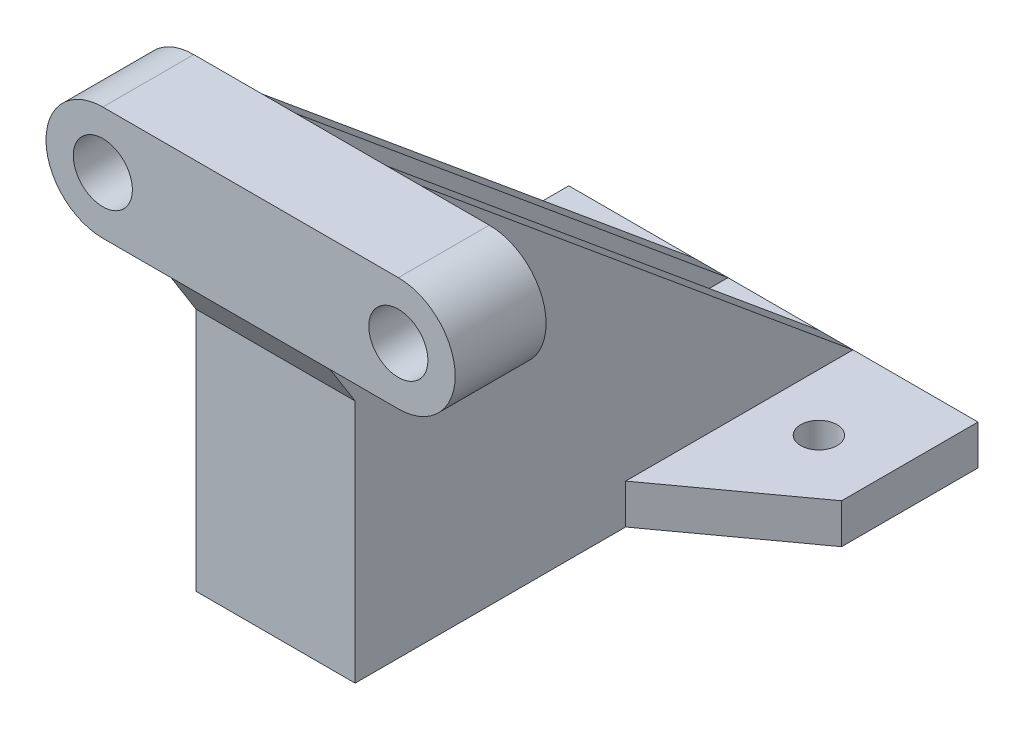
ISO-10303-21;
HEADER;
FILE_DESCRIPTION(('STEP AP214'),'2;1');
FILE_NAME('part.step','',(''),(''),'','','');
FILE_SCHEMA(('AUTOMOTIVE_DESIGN { 1 0 10303 214 1 1 1 1 }'));
ENDSEC;
DATA;
#1=APPLICATION_CONTEXT('core data for automotive mechanical design processes');
#2=APPLICATION_PROTOCOL_DEFINITION('international standard','automotive_design',2000,#1);
#3=PRODUCT_CONTEXT('',#1,'mechanical');
#4=PRODUCT('Part','Part','',(#3));
#5=PRODUCT_RELATED_PRODUCT_CATEGORY('part','',(#4));
#6=PRODUCT_DEFINITION_FORMATION('','',#4);
#7=PRODUCT_DEFINITION_CONTEXT('part definition',#1,'design');
#8=PRODUCT_DEFINITION('design','',#6,#7);
#9=PRODUCT_DEFINITION_SHAPE('','',#8);
#10=(LENGTH_UNIT() NAMED_UNIT(*) SI_UNIT(.MILLI.,.METRE.));
#11=(NAMED_UNIT(*) PLANE_ANGLE_UNIT() SI_UNIT($,.RADIAN.));
#12=(NAMED_UNIT(*) SI_UNIT($,.STERADIAN.) SOLID_ANGLE_UNIT());
#13=UNCERTAINTY_MEASURE_WITH_UNIT(LENGTH_MEASURE(1.E-05),#10,'distance_accuracy_value','');
#14=(GEOMETRIC_REPRESENTATION_CONTEXT(3) GLOBAL_UNCERTAINTY_ASSIGNED_CONTEXT((#13)) GLOBAL_UNIT_ASSIGNED_CONTEXT((#10,
#11,#12)) REPRESENTATION_CONTEXT('',''));
#15=CARTESIAN_POINT('',(0.,0.,0.));
#16=DIRECTION('',(0.,0.,1.));
#17=DIRECTION('',(1.,0.,0.));
#18=AXIS2_PLACEMENT_3D('',#15,#16,#17);
#19=CARTESIAN_POINT('',(-13.,30.,0.));
#20=DIRECTION('',(0.,0.,1.));
#21=DIRECTION('',(1.,0.,0.));
#22=AXIS2_PLACEMENT_3D('',#19,#20,#21);
#23=PLANE('',#22);
#24=DIRECTION('',(0.,-1.,0.));
#25=VECTOR('',#24,1.);
#26=CARTESIAN_POINT('',(4.,3.5,0.));
#27=LINE('',#26,#25);
#28=CARTESIAN_POINT('',(4.,35.,0.));
#29=VERTEX_POINT('',#28);
#30=CARTESIAN_POINT('',(4.,5.5,0.));
#31=VERTEX_POINT('',#30);
#32=EDGE_CURVE('E254',#29,#31,#27,.T.);
#33=ORIENTED_EDGE('',*,*,#32,.T.);
#34=DIRECTION('',(-1.,0.,0.));
#35=VECTOR('',#34,1.);
#36=CARTESIAN_POINT('',(-13.,5.5,0.));
#37=LINE('',#36,#35);
#38=CARTESIAN_POINT('',(-4.,5.5,0.));
#39=VERTEX_POINT('',#38);
#40=EDGE_CURVE('E26',#31,#39,#37,.T.);
#41=ORIENTED_EDGE('',*,*,#40,.T.);
#42=DIRECTION('',(0.,-1.,0.));
#43=VECTOR('',#42,1.);
#44=CARTESIAN_POINT('',(-4.,3.5,0.));
#45=LINE('',#44,#43);
#46=CARTESIAN_POINT('',(-4.,35.,0.));
#47=VERTEX_POINT('',#46);
#48=EDGE_CURVE('E225',#47,#39,#45,.T.);
#49=ORIENTED_EDGE('',*,*,#48,.F.);
#50=DIRECTION('',(-1.,0.,0.));
#51=VECTOR('',#50,1.);
#52=CARTESIAN_POINT('',(-13.,35.,0.));
#53=LINE('',#52,#51);
#54=EDGE_CURVE('E447',#29,#47,#53,.T.);
#55=ORIENTED_EDGE('',*,*,#54,.F.);
#56=EDGE_LOOP('',(#33,#41,#49,#55));
#57=FACE_BOUND('',#56,.T.);
#58=ADVANCED_FACE('F17',(#57),#23,.F.);
#59=CARTESIAN_POINT('',(-7.,3.5,0.));
#60=DIRECTION('',(0.,1.,0.));
#61=DIRECTION('',(0.,0.,1.));
#62=AXIS2_PLACEMENT_3D('',#59,#60,#61);
#63=PLANE('',#62);
#64=CARTESIAN_POINT('',(0.,3.5,-30.));
#65=DIRECTION('',(0.,1.,0.));
#66=DIRECTION('',(0.,0.,1.));
#67=AXIS2_PLACEMENT_3D('',#64,#65,#66);
#68=CIRCLE('',#67,1.6);
#69=CARTESIAN_POINT('',(0.,3.5,-28.4));
#70=VERTEX_POINT('',#69);
#71=EDGE_CURVE('E291',#70,#70,#68,.T.);
#72=ORIENTED_EDGE('',*,*,#71,.F.);
#73=EDGE_LOOP('',(#72));
#74=FACE_BOUND('',#73,.T.);
#75=CARTESIAN_POINT('',(0.,3.5,-18.));
#76=DIRECTION('',(0.,1.,0.));
#77=DIRECTION('',(0.,0.,1.));
#78=AXIS2_PLACEMENT_3D('',#75,#76,#77);
#79=CIRCLE('',#78,1.6);
#80=CARTESIAN_POINT('',(0.,3.5,-16.4));
#81=VERTEX_POINT('',#80);
#82=EDGE_CURVE('E307',#81,#81,#79,.T.);
#83=ORIENTED_EDGE('',*,*,#82,.F.);
#84=EDGE_LOOP('',(#83));
#85=FACE_BOUND('',#84,.T.);
#86=CARTESIAN_POINT('',(0.,3.5,-6.));
#87=DIRECTION('',(0.,1.,0.));
#88=DIRECTION('',(0.,0.,1.));
#89=AXIS2_PLACEMENT_3D('',#86,#87,#88);
#90=CIRCLE('',#89,1.6);
#91=CARTESIAN_POINT('',(0.,3.5,-4.4));
#92=VERTEX_POINT('',#91);
#93=EDGE_CURVE('E315',#92,#92,#90,.T.);
#94=ORIENTED_EDGE('',*,*,#93,.F.);
#95=EDGE_LOOP('',(#94));
#96=FACE_BOUND('',#95,.T.);
#97=DIRECTION('',(0.,0.,-1.));
#98=VECTOR('',#97,1.);
#99=CARTESIAN_POINT('',(-4.,3.5,-38.));
#100=LINE('',#99,#98);
#101=CARTESIAN_POINT('',(-4.,3.5,-2.));
#102=VERTEX_POINT('',#101);
#103=CARTESIAN_POINT('',(-4.,3.5,-38.));
#104=VERTEX_POINT('',#103);
#105=EDGE_CURVE('E253',#102,#104,#100,.T.);
#106=ORIENTED_EDGE('',*,*,#105,.F.);
#107=DIRECTION('',(1.,0.,0.));
#108=VECTOR('',#107,1.);
#109=CARTESIAN_POINT('',(-7.,3.5,-2.));
#110=LINE('',#109,#108);
#111=CARTESIAN_POINT('',(4.,3.5,-2.));
#112=VERTEX_POINT('',#111);
#113=EDGE_CURVE('E474',#102,#112,#110,.T.);
#114=ORIENTED_EDGE('',*,*,#113,.T.);
#115=DIRECTION('',(0.,0.,-1.));
#116=VECTOR('',#115,1.);
#117=CARTESIAN_POINT('',(4.,3.5,-38.));
#118=LINE('',#117,#116);
#119=CARTESIAN_POINT('',(4.,3.5,-38.));
#120=VERTEX_POINT('',#119);
#121=EDGE_CURVE('E257',#112,#120,#118,.T.);
#122=ORIENTED_EDGE('',*,*,#121,.T.);
#123=DIRECTION('',(-1.,0.,0.));
#124=VECTOR('',#123,1.);
#125=CARTESIAN_POINT('',(7.,3.5,-38.));
#126=LINE('',#125,#124);
#127=EDGE_CURVE('E210',#120,#104,#126,.T.);
#128=ORIENTED_EDGE('',*,*,#127,.T.);
#129=EDGE_LOOP('',(#106,#114,#122,#128));
#130=FACE_BOUND('',#129,.T.);
#131=ADVANCED_FACE('F579',(#74,#85,#96,#130),#63,.T.);
#132=CARTESIAN_POINT('',(-13.,30.,0.));
#133=DIRECTION('',(0.,0.,1.));
#134=DIRECTION('',(1.,0.,0.));
#135=AXIS2_PLACEMENT_3D('',#132,#133,#134);
#136=CIRCLE('',#135,2.6);
#137=CARTESIAN_POINT('',(-10.4,30.,0.));
#138=VERTEX_POINT('',#137);
#139=EDGE_CURVE('E402',#138,#138,#136,.T.);
#140=ORIENTED_EDGE('',*,*,#139,.T.);
#141=EDGE_LOOP('',(#140));
#142=FACE_BOUND('',#141,.T.);
#143=CARTESIAN_POINT('',(-7.,35.,0.));
#144=VERTEX_POINT('',#143);
#145=CARTESIAN_POINT('',(-13.,35.,0.));
#146=VERTEX_POINT('',#145);
#147=EDGE_CURVE('E443',#144,#146,#53,.T.);
#148=ORIENTED_EDGE('',*,*,#147,.F.);
#149=DIRECTION('',(0.,-1.,0.));
#150=VECTOR('',#149,1.);
#151=CARTESIAN_POINT('',(-7.,3.5,0.));
#152=LINE('',#151,#150);
#153=CARTESIAN_POINT('',(-7.,25.,0.));
#154=VERTEX_POINT('',#153);
#155=EDGE_CURVE('E242',#144,#154,#152,.T.);
#156=ORIENTED_EDGE('',*,*,#155,.T.);
#157=DIRECTION('',(1.,0.,0.));
#158=VECTOR('',#157,1.);
#159=CARTESIAN_POINT('',(-13.,25.,0.));
#160=LINE('',#159,#158);
#161=CARTESIAN_POINT('',(-13.,25.,0.));
#162=VERTEX_POINT('',#161);
#163=EDGE_CURVE('E436',#162,#154,#160,.T.);
#164=ORIENTED_EDGE('',*,*,#163,.F.);
#165=CARTESIAN_POINT('',(-13.,30.,0.));
#166=DIRECTION('',(0.,0.,1.));
#167=DIRECTION('',(1.,0.,0.));
#168=AXIS2_PLACEMENT_3D('',#165,#166,#167);
#169=CIRCLE('',#168,5.);
#170=EDGE_CURVE('E410',#146,#162,#169,.T.);
#171=ORIENTED_EDGE('',*,*,#170,.F.);
#172=EDGE_LOOP('',(#148,#156,#164,#171));
#173=FACE_BOUND('',#172,.T.);
#174=ADVANCED_FACE('F634',(#142,#173),#23,.F.);
#175=DIRECTION('',(0.,0.,-1.));
#176=VECTOR('',#175,1.);
#177=CARTESIAN_POINT('',(-7.,3.5,-38.));
#178=LINE('',#177,#176);
#179=CARTESIAN_POINT('',(-7.,3.5,-18.));
#180=VERTEX_POINT('',#179);
#181=CARTESIAN_POINT('',(-7.,3.5,-38.));
#182=VERTEX_POINT('',#181);
#183=EDGE_CURVE('E215',#180,#182,#178,.T.);
#184=ORIENTED_EDGE('',*,*,#183,.T.);
#185=CARTESIAN_POINT('',(-18.,3.5,-38.));
#186=VERTEX_POINT('',#185);
#187=EDGE_CURVE('E198',#182,#186,#126,.T.);
#188=ORIENTED_EDGE('',*,*,#187,.T.);
#189=DIRECTION('',(0.,0.,1.));
#190=VECTOR('',#189,1.);
#191=CARTESIAN_POINT('',(-18.,3.5,-38.));
#192=LINE('',#191,#190);
#193=CARTESIAN_POINT('',(-18.,3.5,-26.));
#194=VERTEX_POINT('',#193);
#195=EDGE_CURVE('E331',#186,#194,#192,.T.);
#196=ORIENTED_EDGE('',*,*,#195,.T.);
#197=DIRECTION('',(0.808736084303188,0.,0.588171697675046));
#198=VECTOR('',#197,1.);
#199=CARTESIAN_POINT('',(-18.,3.5,-26.));
#200=LINE('',#199,#198);
#201=EDGE_CURVE('E219',#194,#180,#200,.T.);
#202=ORIENTED_EDGE('',*,*,#201,.T.);
#203=EDGE_LOOP('',(#184,#188,#196,#202));
#204=FACE_BOUND('',#203,.T.);
#205=CARTESIAN_POINT('',(-12.,3.5,-30.));
#206=DIRECTION('',(0.,1.,0.));
#207=DIRECTION('',(0.,0.,1.));
#208=AXIS2_PLACEMENT_3D('',#205,#206,#207);
#209=CIRCLE('',#208,1.6);
#210=CARTESIAN_POINT('',(-12.,3.5,-28.4));
#211=VERTEX_POINT('',#210);
#212=EDGE_CURVE('E299',#211,#211,#209,.T.);
#213=ORIENTED_EDGE('',*,*,#212,.F.);
#214=EDGE_LOOP('',(#213));
#215=FACE_BOUND('',#214,.T.);
#216=ADVANCED_FACE('F216',(#204,#215),#63,.T.);
#217=CARTESIAN_POINT('',(13.,30.,0.));
#218=DIRECTION('',(0.,0.,1.));
#219=DIRECTION('',(1.,0.,0.));
#220=AXIS2_PLACEMENT_3D('',#217,#218,#219);
#221=CIRCLE('',#220,2.6);
#222=CARTESIAN_POINT('',(15.6,30.,0.));
#223=VERTEX_POINT('',#222);
#224=EDGE_CURVE('E382',#223,#223,#221,.T.);
#225=ORIENTED_EDGE('',*,*,#224,.T.);
#226=EDGE_LOOP('',(#225));
#227=FACE_BOUND('',#226,.T.);
#228=CARTESIAN_POINT('',(7.,25.,0.));
#229=VERTEX_POINT('',#228);
#230=CARTESIAN_POINT('',(13.,25.,0.));
#231=VERTEX_POINT('',#230);
#232=EDGE_CURVE('E435',#229,#231,#160,.T.);
#233=ORIENTED_EDGE('',*,*,#232,.F.);
#234=DIRECTION('',(0.,-1.,0.));
#235=VECTOR('',#234,1.);
#236=CARTESIAN_POINT('',(7.,3.5,0.));
#237=LINE('',#236,#235);
#238=CARTESIAN_POINT('',(7.,35.,0.));
#239=VERTEX_POINT('',#238);
#240=EDGE_CURVE('E237',#239,#229,#237,.T.);
#241=ORIENTED_EDGE('',*,*,#240,.F.);
#242=CARTESIAN_POINT('',(13.,35.,0.));
#243=VERTEX_POINT('',#242);
#244=EDGE_CURVE('E419',#243,#239,#53,.T.);
#245=ORIENTED_EDGE('',*,*,#244,.F.);
#246=CARTESIAN_POINT('',(13.,30.,0.));
#247=DIRECTION('',(0.,0.,1.));
#248=DIRECTION('',(1.,0.,0.));
#249=AXIS2_PLACEMENT_3D('',#246,#247,#248);
#250=CIRCLE('',#249,5.);
#251=EDGE_CURVE('E440',#231,#243,#250,.T.);
#252=ORIENTED_EDGE('',*,*,#251,.F.);
#253=EDGE_LOOP('',(#233,#241,#245,#252));
#254=FACE_BOUND('',#253,.T.);
#255=ADVANCED_FACE('F640',(#227,#254),#23,.F.);
#256=CARTESIAN_POINT('',(-13.,25.,8.));
#257=DIRECTION('',(0.,1.,0.));
#258=DIRECTION('',(0.,0.,1.));
#259=AXIS2_PLACEMENT_3D('',#256,#257,#258);
#260=PLANE('',#259);
#261=DIRECTION('',(0.,0.,-1.));
#262=VECTOR('',#261,1.);
#263=CARTESIAN_POINT('',(-7.,25.,5.8));
#264=LINE('',#263,#262);
#265=CARTESIAN_POINT('',(-7.,25.,8.));
#266=VERTEX_POINT('',#265);
#267=EDGE_CURVE('E372',#266,#154,#264,.T.);
#268=ORIENTED_EDGE('',*,*,#267,.F.);
#269=DIRECTION('',(1.,0.,0.));
#270=VECTOR('',#269,1.);
#271=CARTESIAN_POINT('',(-13.,25.,8.));
#272=LINE('',#271,#270);
#273=CARTESIAN_POINT('',(-13.,25.,8.));
#274=VERTEX_POINT('',#273);
#275=EDGE_CURVE('E420',#274,#266,#272,.T.);
#276=ORIENTED_EDGE('',*,*,#275,.F.);
#277=DIRECTION('',(0.,0.,-1.));
#278=VECTOR('',#277,1.);
#279=CARTESIAN_POINT('',(-13.,25.,8.));
#280=LINE('',#279,#278);
#281=EDGE_CURVE('E459',#274,#162,#280,.T.);
#282=ORIENTED_EDGE('',*,*,#281,.T.);
#283=ORIENTED_EDGE('',*,*,#163,.T.);
#284=EDGE_LOOP('',(#268,#276,#282,#283));
#285=FACE_BOUND('',#284,.T.);
#286=ADVANCED_FACE('F631',(#285),#260,.F.);
#287=CARTESIAN_POINT('',(7.,25.,8.));
#288=VERTEX_POINT('',#287);
#289=CARTESIAN_POINT('',(13.,25.,8.));
#290=VERTEX_POINT('',#289);
#291=EDGE_CURVE('E418',#288,#290,#272,.T.);
#292=ORIENTED_EDGE('',*,*,#291,.F.);
#293=DIRECTION('',(0.,0.,1.));
#294=VECTOR('',#293,1.);
#295=CARTESIAN_POINT('',(7.,25.,0.));
#296=LINE('',#295,#294);
#297=EDGE_CURVE('E385',#229,#288,#296,.T.);
#298=ORIENTED_EDGE('',*,*,#297,.F.);
#299=ORIENTED_EDGE('',*,*,#232,.T.);
#300=DIRECTION('',(0.,0.,-1.));
#301=VECTOR('',#300,1.);
#302=CARTESIAN_POINT('',(13.,25.,8.));
#303=LINE('',#302,#301);
#304=EDGE_CURVE('E455',#290,#231,#303,.T.);
#305=ORIENTED_EDGE('',*,*,#304,.F.);
#306=EDGE_LOOP('',(#292,#298,#299,#305));
#307=FACE_BOUND('',#306,.T.);
#308=ADVANCED_FACE('F657',(#307),#260,.F.);
#309=CARTESIAN_POINT('',(-13.,30.,8.));
#310=DIRECTION('',(0.,0.,1.));
#311=DIRECTION('',(1.,0.,0.));
#312=AXIS2_PLACEMENT_3D('',#309,#310,#311);
#313=PLANE('',#312);
#314=CARTESIAN_POINT('',(-13.,30.,8.));
#315=DIRECTION('',(0.,0.,1.));
#316=DIRECTION('',(1.,0.,0.));
#317=AXIS2_PLACEMENT_3D('',#314,#315,#316);
#318=CIRCLE('',#317,2.6);
#319=CARTESIAN_POINT('',(-10.4,30.,8.));
#320=VERTEX_POINT('',#319);
#321=EDGE_CURVE('E406',#320,#320,#318,.T.);
#322=ORIENTED_EDGE('',*,*,#321,.F.);
#323=EDGE_LOOP('',(#322));
#324=FACE_BOUND('',#323,.T.);
#325=CARTESIAN_POINT('',(-13.,30.,8.));
#326=DIRECTION('',(0.,0.,1.));
#327=DIRECTION('',(1.,0.,0.));
#328=AXIS2_PLACEMENT_3D('',#325,#326,#327);
#329=CIRCLE('',#328,5.);
#330=CARTESIAN_POINT('',(-13.,35.,8.));
#331=VERTEX_POINT('',#330);
#332=EDGE_CURVE('E414',#331,#274,#329,.T.);
#333=ORIENTED_EDGE('',*,*,#332,.T.);
#334=ORIENTED_EDGE('',*,*,#275,.T.);
#335=EDGE_CURVE('E425',#266,#288,#272,.T.);
#336=ORIENTED_EDGE('',*,*,#335,.T.);
#337=ORIENTED_EDGE('',*,*,#291,.T.);
#338=CARTESIAN_POINT('',(13.,30.,8.));
#339=DIRECTION('',(0.,0.,1.));
#340=DIRECTION('',(1.,0.,0.));
#341=AXIS2_PLACEMENT_3D('',#338,#339,#340);
#342=CIRCLE('',#341,5.);
#343=CARTESIAN_POINT('',(13.,35.,8.));
#344=VERTEX_POINT('',#343);
#345=EDGE_CURVE('E424',#290,#344,#342,.T.);
#346=ORIENTED_EDGE('',*,*,#345,.T.);
#347=DIRECTION('',(-1.,0.,0.));
#348=VECTOR('',#347,1.);
#349=CARTESIAN_POINT('',(-13.,35.,8.));
#350=LINE('',#349,#348);
#351=EDGE_CURVE('E428',#344,#331,#350,.T.);
#352=ORIENTED_EDGE('',*,*,#351,.T.);
#353=EDGE_LOOP('',(#333,#334,#336,#337,#346,#352));
#354=FACE_BOUND('',#353,.T.);
#355=CARTESIAN_POINT('',(13.,30.,8.));
#356=DIRECTION('',(0.,0.,1.));
#357=DIRECTION('',(1.,0.,0.));
#358=AXIS2_PLACEMENT_3D('',#355,#356,#357);
#359=CIRCLE('',#358,2.6);
#360=CARTESIAN_POINT('',(15.6,30.,8.));
#361=VERTEX_POINT('',#360);
#362=EDGE_CURVE('E398',#361,#361,#359,.T.);
#363=ORIENTED_EDGE('',*,*,#362,.F.);
#364=EDGE_LOOP('',(#363));
#365=FACE_BOUND('',#364,.T.);
#366=ADVANCED_FACE('F624',(#324,#354,#365),#313,.T.);
#367=CARTESIAN_POINT('',(-13.,30.,8.));
#368=DIRECTION('',(0.,0.,-1.));
#369=DIRECTION('',(-1.,0.,0.));
#370=AXIS2_PLACEMENT_3D('',#367,#368,#369);
#371=CYLINDRICAL_SURFACE('',#370,5.);
#372=ORIENTED_EDGE('',*,*,#170,.T.);
#373=ORIENTED_EDGE('',*,*,#281,.F.);
#374=ORIENTED_EDGE('',*,*,#332,.F.);
#375=DIRECTION('',(0.,0.,-1.));
#376=VECTOR('',#375,1.);
#377=CARTESIAN_POINT('',(-13.,35.,8.));
#378=LINE('',#377,#376);
#379=EDGE_CURVE('E431',#331,#146,#378,.T.);
#380=ORIENTED_EDGE('',*,*,#379,.T.);
#381=EDGE_LOOP('',(#372,#373,#374,#380));
#382=FACE_BOUND('',#381,.T.);
#383=ADVANCED_FACE('F671',(#382),#371,.T.);
#384=CARTESIAN_POINT('',(13.,30.,8.));
#385=DIRECTION('',(0.,0.,-1.));
#386=DIRECTION('',(-1.,0.,0.));
#387=AXIS2_PLACEMENT_3D('',#384,#385,#386);
#388=CYLINDRICAL_SURFACE('',#387,5.);
#389=ORIENTED_EDGE('',*,*,#251,.T.);
#390=DIRECTION('',(0.,0.,-1.));
#391=VECTOR('',#390,1.);
#392=CARTESIAN_POINT('',(13.,35.,8.));
#393=LINE('',#392,#391);
#394=EDGE_CURVE('E451',#344,#243,#393,.T.);
#395=ORIENTED_EDGE('',*,*,#394,.F.);
#396=ORIENTED_EDGE('',*,*,#345,.F.);
#397=ORIENTED_EDGE('',*,*,#304,.T.);
#398=EDGE_LOOP('',(#389,#395,#396,#397));
#399=FACE_BOUND('',#398,.T.);
#400=ADVANCED_FACE('F668',(#399),#388,.T.);
#401=CARTESIAN_POINT('',(-13.,35.,8.));
#402=DIRECTION('',(0.,-1.,0.));
#403=DIRECTION('',(0.,0.,-1.));
#404=AXIS2_PLACEMENT_3D('',#401,#402,#403);
#405=PLANE('',#404);
#406=ORIENTED_EDGE('',*,*,#244,.T.);
#407=DIRECTION('',(1.,0.,0.));
#408=VECTOR('',#407,1.);
#409=CARTESIAN_POINT('',(4.,35.,0.));
#410=LINE('',#409,#408);
#411=EDGE_CURVE('E276',#29,#239,#410,.T.);
#412=ORIENTED_EDGE('',*,*,#411,.F.);
#413=ORIENTED_EDGE('',*,*,#54,.T.);
#414=DIRECTION('',(-1.,0.,0.));
#415=VECTOR('',#414,1.);
#416=CARTESIAN_POINT('',(-4.,35.,0.));
#417=LINE('',#416,#415);
#418=EDGE_CURVE('E238',#47,#144,#417,.T.);
#419=ORIENTED_EDGE('',*,*,#418,.T.);
#420=ORIENTED_EDGE('',*,*,#147,.T.);
#421=ORIENTED_EDGE('',*,*,#379,.F.);
#422=ORIENTED_EDGE('',*,*,#351,.F.);
#423=ORIENTED_EDGE('',*,*,#394,.T.);
#424=EDGE_LOOP('',(#406,#412,#413,#419,#420,#421,#422,#423));
#425=FACE_BOUND('',#424,.T.);
#426=ADVANCED_FACE('F637',(#425),#405,.F.);
#427=CARTESIAN_POINT('',(-13.,30.,8.));
#428=DIRECTION('',(0.,0.,-1.));
#429=DIRECTION('',(-1.,0.,0.));
#430=AXIS2_PLACEMENT_3D('',#427,#428,#429);
#431=CYLINDRICAL_SURFACE('',#430,2.6);
#432=ORIENTED_EDGE('',*,*,#321,.T.);
#433=EDGE_LOOP('',(#432));
#434=FACE_BOUND('',#433,.T.);
#435=ORIENTED_EDGE('',*,*,#139,.F.);
#436=EDGE_LOOP('',(#435));
#437=FACE_BOUND('',#436,.T.);
#438=ADVANCED_FACE('F700',(#434,#437),#431,.F.);
#439=CARTESIAN_POINT('',(13.,30.,8.));
#440=DIRECTION('',(0.,0.,-1.));
#441=DIRECTION('',(-1.,0.,0.));
#442=AXIS2_PLACEMENT_3D('',#439,#440,#441);
#443=CYLINDRICAL_SURFACE('',#442,2.6);
#444=ORIENTED_EDGE('',*,*,#362,.T.);
#445=EDGE_LOOP('',(#444));
#446=FACE_BOUND('',#445,.T.);
#447=ORIENTED_EDGE('',*,*,#224,.F.);
#448=EDGE_LOOP('',(#447));
#449=FACE_BOUND('',#448,.T.);
#450=ADVANCED_FACE('F695',(#446,#449),#443,.F.);
#451=CARTESIAN_POINT('',(7.,-15.1538773916117,0.));
#452=DIRECTION('',(-1.,0.,0.));
#453=DIRECTION('',(0.,0.,1.));
#454=AXIS2_PLACEMENT_3D('',#451,#452,#453);
#455=PLANE('',#454);
#456=ORIENTED_EDGE('',*,*,#240,.T.);
#457=ORIENTED_EDGE('',*,*,#297,.T.);
#458=DIRECTION('',(0.,0.846636549211004,0.532171545218347));
#459=VECTOR('',#458,1.);
#460=CARTESIAN_POINT('',(7.,-7.38648320931787,-12.3572180172856));
#461=LINE('',#460,#459);
#462=CARTESIAN_POINT('',(7.,21.5,5.8));
#463=VERTEX_POINT('',#462);
#464=EDGE_CURVE('E471',#288,#463,#461,.F.);
#465=ORIENTED_EDGE('',*,*,#464,.T.);
#466=DIRECTION('',(0.,1.,0.));
#467=VECTOR('',#466,1.);
#468=CARTESIAN_POINT('',(7.,-15.1538773916117,5.8));
#469=LINE('',#468,#467);
#470=CARTESIAN_POINT('',(7.,0.,5.8));
#471=VERTEX_POINT('',#470);
#472=EDGE_CURVE('E388',#471,#463,#469,.T.);
#473=ORIENTED_EDGE('',*,*,#472,.F.);
#474=DIRECTION('',(0.,0.,-1.));
#475=VECTOR('',#474,1.);
#476=CARTESIAN_POINT('',(7.,0.,0.));
#477=LINE('',#476,#475);
#478=CARTESIAN_POINT('',(7.,0.,-18.));
#479=VERTEX_POINT('',#478);
#480=EDGE_CURVE('E378',#471,#479,#477,.T.);
#481=ORIENTED_EDGE('',*,*,#480,.T.);
#482=DIRECTION('',(0.,-1.,0.));
#483=VECTOR('',#482,1.);
#484=CARTESIAN_POINT('',(7.,3.5,-18.));
#485=LINE('',#484,#483);
#486=CARTESIAN_POINT('',(7.,3.5,-18.));
#487=VERTEX_POINT('',#486);
#488=EDGE_CURVE('E368',#487,#479,#485,.T.);
#489=ORIENTED_EDGE('',*,*,#488,.F.);
#490=DIRECTION('',(0.,0.,-1.));
#491=VECTOR('',#490,1.);
#492=CARTESIAN_POINT('',(7.,3.5,-38.));
#493=LINE('',#492,#491);
#494=CARTESIAN_POINT('',(7.,3.5,-38.));
#495=VERTEX_POINT('',#494);
#496=EDGE_CURVE('E269',#487,#495,#493,.T.);
#497=ORIENTED_EDGE('',*,*,#496,.T.);
#498=DIRECTION('',(0.,0.638189460570586,0.769879349259755));
#499=VECTOR('',#498,1.);
#500=CARTESIAN_POINT('',(7.,35.,0.));
#501=LINE('',#500,#499);
#502=EDGE_CURVE('E258',#495,#239,#501,.T.);
#503=ORIENTED_EDGE('',*,*,#502,.T.);
#504=EDGE_LOOP('',(#456,#457,#465,#473,#481,#489,#497,#503));
#505=FACE_BOUND('',#504,.T.);
#506=ADVANCED_FACE('F595',(#505),#455,.F.);
#507=CARTESIAN_POINT('',(-7.,-15.1538773916117,5.8));
#508=DIRECTION('',(1.,0.,0.));
#509=DIRECTION('',(0.,0.,-1.));
#510=AXIS2_PLACEMENT_3D('',#507,#508,#509);
#511=PLANE('',#510);
#512=ORIENTED_EDGE('',*,*,#267,.T.);
#513=ORIENTED_EDGE('',*,*,#155,.F.);
#514=DIRECTION('',(0.,0.638189460570586,0.769879349259755));
#515=VECTOR('',#514,1.);
#516=CARTESIAN_POINT('',(-7.,35.,0.));
#517=LINE('',#516,#515);
#518=EDGE_CURVE('E226',#182,#144,#517,.T.);
#519=ORIENTED_EDGE('',*,*,#518,.F.);
#520=ORIENTED_EDGE('',*,*,#183,.F.);
#521=DIRECTION('',(0.,-1.,0.));
#522=VECTOR('',#521,1.);
#523=CARTESIAN_POINT('',(-7.,3.5,-18.));
#524=LINE('',#523,#522);
#525=CARTESIAN_POINT('',(-7.,0.,-18.));
#526=VERTEX_POINT('',#525);
#527=EDGE_CURVE('E336',#180,#526,#524,.T.);
#528=ORIENTED_EDGE('',*,*,#527,.T.);
#529=DIRECTION('',(0.,0.,1.));
#530=VECTOR('',#529,1.);
#531=CARTESIAN_POINT('',(-7.,0.,5.8));
#532=LINE('',#531,#530);
#533=CARTESIAN_POINT('',(-7.,0.,5.8));
#534=VERTEX_POINT('',#533);
#535=EDGE_CURVE('E373',#526,#534,#532,.T.);
#536=ORIENTED_EDGE('',*,*,#535,.T.);
#537=DIRECTION('',(0.,1.,0.));
#538=VECTOR('',#537,1.);
#539=CARTESIAN_POINT('',(-7.,-15.1538773916117,5.8));
#540=LINE('',#539,#538);
#541=CARTESIAN_POINT('',(-7.,21.5,5.8));
#542=VERTEX_POINT('',#541);
#543=EDGE_CURVE('E392',#534,#542,#540,.T.);
#544=ORIENTED_EDGE('',*,*,#543,.T.);
#545=DIRECTION('',(0.,-0.846636549211004,-0.532171545218347));
#546=VECTOR('',#545,1.);
#547=CARTESIAN_POINT('',(-7.,-4.77325910165256,-10.7146200067531));
#548=LINE('',#547,#546);
#549=EDGE_CURVE('E467',#542,#266,#548,.F.);
#550=ORIENTED_EDGE('',*,*,#549,.T.);
#551=EDGE_LOOP('',(#512,#513,#519,#520,#528,#536,#544,#550));
#552=FACE_BOUND('',#551,.T.);
#553=ADVANCED_FACE('F241',(#552),#511,.F.);
#554=CARTESIAN_POINT('',(-7.,-15.1538773916117,5.8));
#555=DIRECTION('',(0.,0.,-1.));
#556=DIRECTION('',(-1.,0.,0.));
#557=AXIS2_PLACEMENT_3D('',#554,#555,#556);
#558=PLANE('',#557);
#559=ORIENTED_EDGE('',*,*,#472,.T.);
#560=DIRECTION('',(-1.,0.,0.));
#561=VECTOR('',#560,1.);
#562=CARTESIAN_POINT('',(-7.,21.5,5.8));
#563=LINE('',#562,#561);
#564=EDGE_CURVE('E463',#463,#542,#563,.T.);
#565=ORIENTED_EDGE('',*,*,#564,.T.);
#566=ORIENTED_EDGE('',*,*,#543,.F.);
#567=DIRECTION('',(1.,0.,0.));
#568=VECTOR('',#567,1.);
#569=CARTESIAN_POINT('',(-7.,0.,5.8));
#570=LINE('',#569,#568);
#571=EDGE_CURVE('E377',#534,#471,#570,.T.);
#572=ORIENTED_EDGE('',*,*,#571,.T.);
#573=EDGE_LOOP('',(#559,#565,#566,#572));
#574=FACE_BOUND('',#573,.T.);
#575=ADVANCED_FACE('F617',(#574),#558,.F.);
#576=CARTESIAN_POINT('',(0.,0.,0.));
#577=DIRECTION('',(0.,1.,0.));
#578=DIRECTION('',(0.,0.,1.));
#579=AXIS2_PLACEMENT_3D('',#576,#577,#578);
#580=PLANE('',#579);
#581=ORIENTED_EDGE('',*,*,#535,.F.);
#582=DIRECTION('',(0.808736084303188,0.,0.588171697675046));
#583=VECTOR('',#582,1.);
#584=CARTESIAN_POINT('',(-18.,0.,-26.));
#585=LINE('',#584,#583);
#586=CARTESIAN_POINT('',(-18.,0.,-26.));
#587=VERTEX_POINT('',#586);
#588=EDGE_CURVE('E326',#587,#526,#585,.T.);
#589=ORIENTED_EDGE('',*,*,#588,.F.);
#590=DIRECTION('',(0.,0.,1.));
#591=VECTOR('',#590,1.);
#592=CARTESIAN_POINT('',(-18.,0.,-38.));
#593=LINE('',#592,#591);
#594=CARTESIAN_POINT('',(-18.,0.,-38.));
#595=VERTEX_POINT('',#594);
#596=EDGE_CURVE('E346',#595,#587,#593,.T.);
#597=ORIENTED_EDGE('',*,*,#596,.F.);
#598=DIRECTION('',(-1.,0.,0.));
#599=VECTOR('',#598,1.);
#600=CARTESIAN_POINT('',(-7.,0.,-38.));
#601=LINE('',#600,#599);
#602=CARTESIAN_POINT('',(18.,0.,-38.));
#603=VERTEX_POINT('',#602);
#604=EDGE_CURVE('E343',#603,#595,#601,.T.);
#605=ORIENTED_EDGE('',*,*,#604,.F.);
#606=DIRECTION('',(0.,0.,-1.));
#607=VECTOR('',#606,1.);
#608=CARTESIAN_POINT('',(18.,0.,-38.));
#609=LINE('',#608,#607);
#610=CARTESIAN_POINT('',(18.,0.,-26.));
#611=VERTEX_POINT('',#610);
#612=EDGE_CURVE('E339',#611,#603,#609,.T.);
#613=ORIENTED_EDGE('',*,*,#612,.F.);
#614=DIRECTION('',(0.808736084303188,0.,-0.588171697675046));
#615=VECTOR('',#614,1.);
#616=CARTESIAN_POINT('',(18.,0.,-26.));
#617=LINE('',#616,#615);
#618=EDGE_CURVE('E319',#479,#611,#617,.T.);
#619=ORIENTED_EDGE('',*,*,#618,.F.);
#620=ORIENTED_EDGE('',*,*,#480,.F.);
#621=ORIENTED_EDGE('',*,*,#571,.F.);
#622=EDGE_LOOP('',(#581,#589,#597,#605,#613,#619,#620,#621));
#623=FACE_BOUND('',#622,.T.);
#624=CARTESIAN_POINT('',(0.,0.,-30.));
#625=DIRECTION('',(0.,1.,0.));
#626=DIRECTION('',(0.,0.,1.));
#627=AXIS2_PLACEMENT_3D('',#624,#625,#626);
#628=CIRCLE('',#627,1.6);
#629=CARTESIAN_POINT('',(0.,0.,-28.4));
#630=VERTEX_POINT('',#629);
#631=EDGE_CURVE('E287',#630,#630,#628,.T.);
#632=ORIENTED_EDGE('',*,*,#631,.T.);
#633=EDGE_LOOP('',(#632));
#634=FACE_BOUND('',#633,.T.);
#635=CARTESIAN_POINT('',(0.,0.,-18.));
#636=DIRECTION('',(0.,1.,0.));
#637=DIRECTION('',(0.,0.,1.));
#638=AXIS2_PLACEMENT_3D('',#635,#636,#637);
#639=CIRCLE('',#638,1.6);
#640=CARTESIAN_POINT('',(0.,0.,-16.4));
#641=VERTEX_POINT('',#640);
#642=EDGE_CURVE('E303',#641,#641,#639,.T.);
#643=ORIENTED_EDGE('',*,*,#642,.T.);
#644=EDGE_LOOP('',(#643));
#645=FACE_BOUND('',#644,.T.);
#646=CARTESIAN_POINT('',(0.,0.,-6.));
#647=DIRECTION('',(0.,1.,0.));
#648=DIRECTION('',(0.,0.,1.));
#649=AXIS2_PLACEMENT_3D('',#646,#647,#648);
#650=CIRCLE('',#649,1.6);
#651=CARTESIAN_POINT('',(0.,0.,-4.4));
#652=VERTEX_POINT('',#651);
#653=EDGE_CURVE('E311',#652,#652,#650,.T.);
#654=ORIENTED_EDGE('',*,*,#653,.T.);
#655=EDGE_LOOP('',(#654));
#656=FACE_BOUND('',#655,.T.);
#657=CARTESIAN_POINT('',(-12.,0.,-30.));
#658=DIRECTION('',(0.,1.,0.));
#659=DIRECTION('',(0.,0.,1.));
#660=AXIS2_PLACEMENT_3D('',#657,#658,#659);
#661=CIRCLE('',#660,1.6);
#662=CARTESIAN_POINT('',(-12.,0.,-28.4));
#663=VERTEX_POINT('',#662);
#664=EDGE_CURVE('E295',#663,#663,#661,.T.);
#665=ORIENTED_EDGE('',*,*,#664,.T.);
#666=EDGE_LOOP('',(#665));
#667=FACE_BOUND('',#666,.T.);
#668=CARTESIAN_POINT('',(12.,0.,-30.));
#669=DIRECTION('',(0.,1.,0.));
#670=DIRECTION('',(0.,0.,-1.));
#671=AXIS2_PLACEMENT_3D('',#668,#669,#670);
#672=CIRCLE('',#671,1.6);
#673=CARTESIAN_POINT('',(12.,0.,-31.6));
#674=VERTEX_POINT('',#673);
#675=EDGE_CURVE('E280',#674,#674,#672,.T.);
#676=ORIENTED_EDGE('',*,*,#675,.T.);
#677=EDGE_LOOP('',(#676));
#678=FACE_BOUND('',#677,.T.);
#679=ADVANCED_FACE('F611',(#623,#634,#645,#656,#667,#678),#580,.F.);
#680=CARTESIAN_POINT('',(-7.,21.5,5.8));
#681=DIRECTION('',(0.,-0.532171545218347,0.846636549211004));
#682=DIRECTION('',(0.,-0.846636549211004,-0.532171545218347));
#683=AXIS2_PLACEMENT_3D('',#680,#681,#682);
#684=PLANE('',#683);
#685=ORIENTED_EDGE('',*,*,#464,.F.);
#686=ORIENTED_EDGE('',*,*,#335,.F.);
#687=ORIENTED_EDGE('',*,*,#549,.F.);
#688=ORIENTED_EDGE('',*,*,#564,.F.);
#689=EDGE_LOOP('',(#685,#686,#687,#688));
#690=FACE_BOUND('',#689,.T.);
#691=ADVANCED_FACE('F621',(#690),#684,.T.);
#692=ORIENTED_EDGE('',*,*,#496,.F.);
#693=DIRECTION('',(0.808736084303188,0.,-0.588171697675046));
#694=VECTOR('',#693,1.);
#695=CARTESIAN_POINT('',(18.,3.5,-26.));
#696=LINE('',#695,#694);
#697=CARTESIAN_POINT('',(18.,3.5,-26.));
#698=VERTEX_POINT('',#697);
#699=EDGE_CURVE('E323',#487,#698,#696,.T.);
#700=ORIENTED_EDGE('',*,*,#699,.T.);
#701=DIRECTION('',(0.,0.,-1.));
#702=VECTOR('',#701,1.);
#703=CARTESIAN_POINT('',(18.,3.5,-38.));
#704=LINE('',#703,#702);
#705=CARTESIAN_POINT('',(18.,3.5,-38.));
#706=VERTEX_POINT('',#705);
#707=EDGE_CURVE('E211',#698,#706,#704,.T.);
#708=ORIENTED_EDGE('',*,*,#707,.T.);
#709=EDGE_CURVE('E213',#706,#495,#126,.T.);
#710=ORIENTED_EDGE('',*,*,#709,.T.);
#711=EDGE_LOOP('',(#692,#700,#708,#710));
#712=FACE_BOUND('',#711,.T.);
#713=CARTESIAN_POINT('',(12.,3.5,-30.));
#714=DIRECTION('',(0.,1.,0.));
#715=DIRECTION('',(0.,0.,-1.));
#716=AXIS2_PLACEMENT_3D('',#713,#714,#715);
#717=CIRCLE('',#716,1.6);
#718=CARTESIAN_POINT('',(12.,3.5,-31.6));
#719=VERTEX_POINT('',#718);
#720=EDGE_CURVE('E283',#719,#719,#717,.T.);
#721=ORIENTED_EDGE('',*,*,#720,.F.);
#722=EDGE_LOOP('',(#721));
#723=FACE_BOUND('',#722,.T.);
#724=ADVANCED_FACE('F589',(#712,#723),#63,.T.);
#725=CARTESIAN_POINT('',(18.,3.5,-26.));
#726=DIRECTION('',(-0.588171697675046,0.,-0.808736084303188));
#727=DIRECTION('',(-0.808736084303189,0.,0.588171697675047));
#728=AXIS2_PLACEMENT_3D('',#725,#726,#727);
#729=PLANE('',#728);
#730=ORIENTED_EDGE('',*,*,#618,.T.);
#731=DIRECTION('',(0.,-1.,0.));
#732=VECTOR('',#731,1.);
#733=CARTESIAN_POINT('',(18.,3.5,-26.));
#734=LINE('',#733,#732);
#735=EDGE_CURVE('E364',#698,#611,#734,.T.);
#736=ORIENTED_EDGE('',*,*,#735,.F.);
#737=ORIENTED_EDGE('',*,*,#699,.F.);
#738=ORIENTED_EDGE('',*,*,#488,.T.);
#739=EDGE_LOOP('',(#730,#736,#737,#738));
#740=FACE_BOUND('',#739,.T.);
#741=ADVANCED_FACE('F601',(#740),#729,.F.);
#742=CARTESIAN_POINT('',(18.,3.5,-38.));
#743=DIRECTION('',(-1.,0.,0.));
#744=DIRECTION('',(0.,0.,1.));
#745=AXIS2_PLACEMENT_3D('',#742,#743,#744);
#746=PLANE('',#745);
#747=ORIENTED_EDGE('',*,*,#612,.T.);
#748=DIRECTION('',(0.,-1.,0.));
#749=VECTOR('',#748,1.);
#750=CARTESIAN_POINT('',(18.,3.5,-38.));
#751=LINE('',#750,#749);
#752=EDGE_CURVE('E360',#706,#603,#751,.T.);
#753=ORIENTED_EDGE('',*,*,#752,.F.);
#754=ORIENTED_EDGE('',*,*,#707,.F.);
#755=ORIENTED_EDGE('',*,*,#735,.T.);
#756=EDGE_LOOP('',(#747,#753,#754,#755));
#757=FACE_BOUND('',#756,.T.);
#758=ADVANCED_FACE('F604',(#757),#746,.F.);
#759=CARTESIAN_POINT('',(-7.,3.5,-38.));
#760=DIRECTION('',(0.,0.,1.));
#761=DIRECTION('',(1.,0.,0.));
#762=AXIS2_PLACEMENT_3D('',#759,#760,#761);
#763=PLANE('',#762);
#764=ORIENTED_EDGE('',*,*,#604,.T.);
#765=DIRECTION('',(0.,-1.,0.));
#766=VECTOR('',#765,1.);
#767=CARTESIAN_POINT('',(-18.,3.5,-38.));
#768=LINE('',#767,#766);
#769=EDGE_CURVE('E206',#186,#595,#768,.T.);
#770=ORIENTED_EDGE('',*,*,#769,.F.);
#771=ORIENTED_EDGE('',*,*,#187,.F.);
#772=DIRECTION('',(-1.,0.,0.));
#773=VECTOR('',#772,1.);
#774=CARTESIAN_POINT('',(-4.,3.5,-38.));
#775=LINE('',#774,#773);
#776=EDGE_CURVE('E203',#104,#182,#775,.T.);
#777=ORIENTED_EDGE('',*,*,#776,.F.);
#778=ORIENTED_EDGE('',*,*,#127,.F.);
#779=DIRECTION('',(1.,0.,0.));
#780=VECTOR('',#779,1.);
#781=CARTESIAN_POINT('',(4.,3.5,-38.));
#782=LINE('',#781,#780);
#783=EDGE_CURVE('E265',#120,#495,#782,.T.);
#784=ORIENTED_EDGE('',*,*,#783,.T.);
#785=ORIENTED_EDGE('',*,*,#709,.F.);
#786=ORIENTED_EDGE('',*,*,#752,.T.);
#787=EDGE_LOOP('',(#764,#770,#771,#777,#778,#784,#785,#786));
#788=FACE_BOUND('',#787,.T.);
#789=ADVANCED_FACE('F200',(#788),#763,.F.);
#790=CARTESIAN_POINT('',(-18.,3.5,-38.));
#791=DIRECTION('',(1.,0.,0.));
#792=DIRECTION('',(0.,0.,-1.));
#793=AXIS2_PLACEMENT_3D('',#790,#791,#792);
#794=PLANE('',#793);
#795=ORIENTED_EDGE('',*,*,#596,.T.);
#796=DIRECTION('',(0.,-1.,0.));
#797=VECTOR('',#796,1.);
#798=CARTESIAN_POINT('',(-18.,3.5,-26.));
#799=LINE('',#798,#797);
#800=EDGE_CURVE('E354',#194,#587,#799,.T.);
#801=ORIENTED_EDGE('',*,*,#800,.F.);
#802=ORIENTED_EDGE('',*,*,#195,.F.);
#803=ORIENTED_EDGE('',*,*,#769,.T.);
#804=EDGE_LOOP('',(#795,#801,#802,#803));
#805=FACE_BOUND('',#804,.T.);
#806=ADVANCED_FACE('F608',(#805),#794,.F.);
#807=CARTESIAN_POINT('',(-18.,3.5,-26.));
#808=DIRECTION('',(0.588171697675046,0.,-0.808736084303188));
#809=DIRECTION('',(-0.808736084303189,0.,-0.588171697675047));
#810=AXIS2_PLACEMENT_3D('',#807,#808,#809);
#811=PLANE('',#810);
#812=ORIENTED_EDGE('',*,*,#588,.T.);
#813=ORIENTED_EDGE('',*,*,#527,.F.);
#814=ORIENTED_EDGE('',*,*,#201,.F.);
#815=ORIENTED_EDGE('',*,*,#800,.T.);
#816=EDGE_LOOP('',(#812,#813,#814,#815));
#817=FACE_BOUND('',#816,.T.);
#818=ADVANCED_FACE('F614',(#817),#811,.F.);
#819=CARTESIAN_POINT('',(0.,3.5,-6.));
#820=DIRECTION('',(0.,-1.,0.));
#821=DIRECTION('',(0.,0.,-1.));
#822=AXIS2_PLACEMENT_3D('',#819,#820,#821);
#823=CYLINDRICAL_SURFACE('',#822,1.6);
#824=ORIENTED_EDGE('',*,*,#93,.T.);
#825=EDGE_LOOP('',(#824));
#826=FACE_BOUND('',#825,.T.);
#827=ORIENTED_EDGE('',*,*,#653,.F.);
#828=EDGE_LOOP('',(#827));
#829=FACE_BOUND('',#828,.T.);
#830=ADVANCED_FACE('F881',(#826,#829),#823,.F.);
#831=CARTESIAN_POINT('',(0.,3.5,-18.));
#832=DIRECTION('',(0.,-1.,0.));
#833=DIRECTION('',(0.,0.,-1.));
#834=AXIS2_PLACEMENT_3D('',#831,#832,#833);
#835=CYLINDRICAL_SURFACE('',#834,1.6);
#836=ORIENTED_EDGE('',*,*,#82,.T.);
#837=EDGE_LOOP('',(#836));
#838=FACE_BOUND('',#837,.T.);
#839=ORIENTED_EDGE('',*,*,#642,.F.);
#840=EDGE_LOOP('',(#839));
#841=FACE_BOUND('',#840,.T.);
#842=ADVANCED_FACE('F890',(#838,#841),#835,.F.);
#843=CARTESIAN_POINT('',(-12.,3.5,-30.));
#844=DIRECTION('',(0.,-1.,0.));
#845=DIRECTION('',(0.,0.,-1.));
#846=AXIS2_PLACEMENT_3D('',#843,#844,#845);
#847=CYLINDRICAL_SURFACE('',#846,1.6);
#848=ORIENTED_EDGE('',*,*,#212,.T.);
#849=EDGE_LOOP('',(#848));
#850=FACE_BOUND('',#849,.T.);
#851=ORIENTED_EDGE('',*,*,#664,.F.);
#852=EDGE_LOOP('',(#851));
#853=FACE_BOUND('',#852,.T.);
#854=ADVANCED_FACE('F900',(#850,#853),#847,.F.);
#855=CARTESIAN_POINT('',(0.,3.5,-30.));
#856=DIRECTION('',(0.,-1.,0.));
#857=DIRECTION('',(0.,0.,-1.));
#858=AXIS2_PLACEMENT_3D('',#855,#856,#857);
#859=CYLINDRICAL_SURFACE('',#858,1.6);
#860=ORIENTED_EDGE('',*,*,#71,.T.);
#861=EDGE_LOOP('',(#860));
#862=FACE_BOUND('',#861,.T.);
#863=ORIENTED_EDGE('',*,*,#631,.F.);
#864=EDGE_LOOP('',(#863));
#865=FACE_BOUND('',#864,.T.);
#866=ADVANCED_FACE('F910',(#862,#865),#859,.F.);
#867=CARTESIAN_POINT('',(12.,3.5,-30.));
#868=DIRECTION('',(0.,-1.,0.));
#869=DIRECTION('',(0.,0.,-1.));
#870=AXIS2_PLACEMENT_3D('',#867,#868,#869);
#871=CYLINDRICAL_SURFACE('',#870,1.6);
#872=ORIENTED_EDGE('',*,*,#720,.T.);
#873=EDGE_LOOP('',(#872));
#874=FACE_BOUND('',#873,.T.);
#875=ORIENTED_EDGE('',*,*,#675,.F.);
#876=EDGE_LOOP('',(#875));
#877=FACE_BOUND('',#876,.T.);
#878=ADVANCED_FACE('F920',(#874,#877),#871,.F.);
#879=CARTESIAN_POINT('',(4.,35.,0.));
#880=DIRECTION('',(0.,0.769879349259755,-0.638189460570587));
#881=DIRECTION('',(0.,0.638189460570587,0.769879349259755));
#882=AXIS2_PLACEMENT_3D('',#879,#880,#881);
#883=PLANE('',#882);
#884=ORIENTED_EDGE('',*,*,#502,.F.);
#885=ORIENTED_EDGE('',*,*,#783,.F.);
#886=DIRECTION('',(0.,0.638189460570586,0.769879349259755));
#887=VECTOR('',#886,1.);
#888=CARTESIAN_POINT('',(4.,35.,0.));
#889=LINE('',#888,#887);
#890=EDGE_CURVE('E261',#120,#29,#889,.T.);
#891=ORIENTED_EDGE('',*,*,#890,.T.);
#892=ORIENTED_EDGE('',*,*,#411,.T.);
#893=EDGE_LOOP('',(#884,#885,#891,#892));
#894=FACE_BOUND('',#893,.T.);
#895=ADVANCED_FACE('F585',(#894),#883,.T.);
#896=CARTESIAN_POINT('',(4.,3.5,0.));
#897=DIRECTION('',(1.,0.,0.));
#898=DIRECTION('',(0.,0.,-1.));
#899=AXIS2_PLACEMENT_3D('',#896,#897,#898);
#900=PLANE('',#899);
#901=ORIENTED_EDGE('',*,*,#121,.F.);
#902=DIRECTION('',(0.,0.707106781186544,0.707106781186551));
#903=VECTOR('',#902,1.);
#904=CARTESIAN_POINT('',(4.,3.5,-2.));
#905=LINE('',#904,#903);
#906=EDGE_CURVE('E46',#112,#31,#905,.T.);
#907=ORIENTED_EDGE('',*,*,#906,.T.);
#908=ORIENTED_EDGE('',*,*,#32,.F.);
#909=ORIENTED_EDGE('',*,*,#890,.F.);
#910=EDGE_LOOP('',(#901,#907,#908,#909));
#911=FACE_BOUND('',#910,.T.);
#912=ADVANCED_FACE('F581',(#911),#900,.F.);
#913=CARTESIAN_POINT('',(-4.,35.,0.));
#914=DIRECTION('',(0.,-0.769879349259755,0.638189460570587));
#915=DIRECTION('',(0.,-0.638189460570587,-0.769879349259755));
#916=AXIS2_PLACEMENT_3D('',#913,#914,#915);
#917=PLANE('',#916);
#918=ORIENTED_EDGE('',*,*,#518,.T.);
#919=ORIENTED_EDGE('',*,*,#418,.F.);
#920=DIRECTION('',(0.,0.638189460570586,0.769879349259755));
#921=VECTOR('',#920,1.);
#922=CARTESIAN_POINT('',(-4.,35.,0.));
#923=LINE('',#922,#921);
#924=EDGE_CURVE('E235',#104,#47,#923,.T.);
#925=ORIENTED_EDGE('',*,*,#924,.F.);
#926=ORIENTED_EDGE('',*,*,#776,.T.);
#927=EDGE_LOOP('',(#918,#919,#925,#926));
#928=FACE_BOUND('',#927,.T.);
#929=ADVANCED_FACE('F231',(#928),#917,.F.);
#930=CARTESIAN_POINT('',(-4.,3.5,0.));
#931=DIRECTION('',(-1.,0.,0.));
#932=DIRECTION('',(0.,0.,-1.));
#933=AXIS2_PLACEMENT_3D('',#930,#931,#932);
#934=PLANE('',#933);
#935=ORIENTED_EDGE('',*,*,#48,.T.);
#936=DIRECTION('',(0.,-0.707106781186544,-0.707106781186551));
#937=VECTOR('',#936,1.);
#938=CARTESIAN_POINT('',(-4.,3.5,-2.));
#939=LINE('',#938,#937);
#940=EDGE_CURVE('E11',#39,#102,#939,.T.);
#941=ORIENTED_EDGE('',*,*,#940,.T.);
#942=ORIENTED_EDGE('',*,*,#105,.T.);
#943=ORIENTED_EDGE('',*,*,#924,.T.);
#944=EDGE_LOOP('',(#935,#941,#942,#943));
#945=FACE_BOUND('',#944,.T.);
#946=ADVANCED_FACE('F574',(#945),#934,.F.);
#947=CARTESIAN_POINT('',(-7.,3.5,-2.));
#948=DIRECTION('',(0.,-0.707106781186551,0.707106781186544));
#949=DIRECTION('',(0.,-0.707106781186544,-0.707106781186551));
#950=AXIS2_PLACEMENT_3D('',#947,#948,#949);
#951=PLANE('',#950);
#952=ORIENTED_EDGE('',*,*,#940,.F.);
#953=ORIENTED_EDGE('',*,*,#40,.F.);
#954=ORIENTED_EDGE('',*,*,#906,.F.);
#955=ORIENTED_EDGE('',*,*,#113,.F.);
#956=EDGE_LOOP('',(#952,#953,#954,#955));
#957=FACE_BOUND('',#956,.T.);
#958=ADVANCED_FACE('F19',(#957),#951,.F.);
#959=CLOSED_SHELL('',(#58,#131,#174,#216,#255,#286,#308,#366,#383,#400,#426,#438,#450,#506,#553,
#575,#679,#691,#724,#741,#758,#789,#806,#818,#830,#842,#854,#866,#878,#895,#912,#929,#946,#958));
#960=MANIFOLD_SOLID_BREP('B1',#959);
#961=ADVANCED_BREP_SHAPE_REPRESENTATION('',(#18,#960),#14);
#962=SHAPE_DEFINITION_REPRESENTATION(#9,#961);
ENDSEC;
END-ISO-10303-21;
